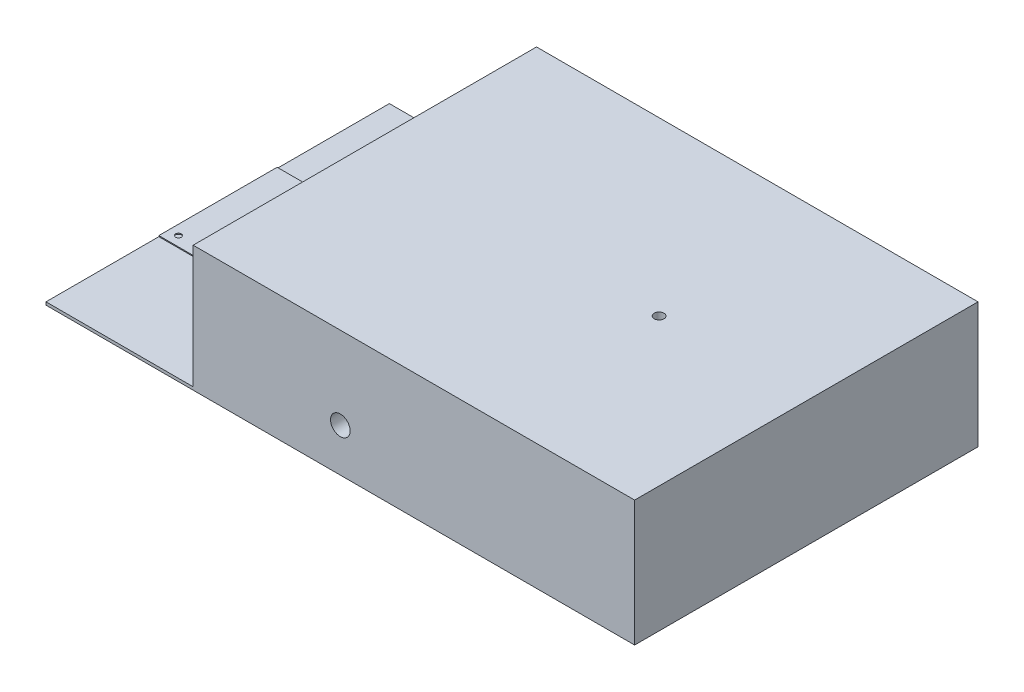
ISO-10303-21;
HEADER;
FILE_DESCRIPTION(('STEP AP214'),'2;1');
FILE_NAME('part.step','',(''),(''),'','','');
FILE_SCHEMA(('AUTOMOTIVE_DESIGN { 1 0 10303 214 1 1 1 1 }'));
ENDSEC;
DATA;
#1=APPLICATION_CONTEXT('core data for automotive mechanical design processes');
#2=APPLICATION_PROTOCOL_DEFINITION('international standard','automotive_design',2000,#1);
#3=PRODUCT_CONTEXT('',#1,'mechanical');
#4=PRODUCT('Part','Part','',(#3));
#5=PRODUCT_RELATED_PRODUCT_CATEGORY('part','',(#4));
#6=PRODUCT_DEFINITION_FORMATION('','',#4);
#7=PRODUCT_DEFINITION_CONTEXT('part definition',#1,'design');
#8=PRODUCT_DEFINITION('design','',#6,#7);
#9=PRODUCT_DEFINITION_SHAPE('','',#8);
#10=(LENGTH_UNIT() NAMED_UNIT(*) SI_UNIT(.MILLI.,.METRE.));
#11=(NAMED_UNIT(*) PLANE_ANGLE_UNIT() SI_UNIT($,.RADIAN.));
#12=(NAMED_UNIT(*) SI_UNIT($,.STERADIAN.) SOLID_ANGLE_UNIT());
#13=UNCERTAINTY_MEASURE_WITH_UNIT(LENGTH_MEASURE(1.E-05),#10,'distance_accuracy_value','');
#14=(GEOMETRIC_REPRESENTATION_CONTEXT(3) GLOBAL_UNCERTAINTY_ASSIGNED_CONTEXT((#13)) GLOBAL_UNIT_ASSIGNED_CONTEXT((#10,
#11,#12)) REPRESENTATION_CONTEXT('',''));
#15=CARTESIAN_POINT('',(0.,0.,0.));
#16=DIRECTION('',(0.,0.,1.));
#17=DIRECTION('',(1.,0.,0.));
#18=AXIS2_PLACEMENT_3D('',#15,#16,#17);
#19=CARTESIAN_POINT('',(300.,3.,-175.));
#20=DIRECTION('',(-1.,0.,0.));
#21=DIRECTION('',(0.,0.,1.));
#22=AXIS2_PLACEMENT_3D('',#19,#20,#21);
#23=PLANE('',#22);
#24=DIRECTION('',(0.,0.,-1.));
#25=VECTOR('',#24,1.);
#26=CARTESIAN_POINT('',(300.,0.,-175.));
#27=LINE('',#26,#25);
#28=CARTESIAN_POINT('',(300.,0.,175.));
#29=VERTEX_POINT('',#28);
#30=CARTESIAN_POINT('',(300.,0.,-175.));
#31=VERTEX_POINT('',#30);
#32=EDGE_CURVE('E166',#29,#31,#27,.T.);
#33=ORIENTED_EDGE('',*,*,#32,.T.);
#34=DIRECTION('',(0.,-1.,0.));
#35=VECTOR('',#34,1.);
#36=CARTESIAN_POINT('',(300.,3.,-175.));
#37=LINE('',#36,#35);
#38=CARTESIAN_POINT('',(300.,128.,-175.));
#39=VERTEX_POINT('',#38);
#40=EDGE_CURVE('E192',#39,#31,#37,.T.);
#41=ORIENTED_EDGE('',*,*,#40,.F.);
#42=DIRECTION('',(0.,0.,-1.));
#43=VECTOR('',#42,1.);
#44=CARTESIAN_POINT('',(300.,128.,-175.));
#45=LINE('',#44,#43);
#46=CARTESIAN_POINT('',(300.,128.,175.));
#47=VERTEX_POINT('',#46);
#48=EDGE_CURVE('E149',#47,#39,#45,.T.);
#49=ORIENTED_EDGE('',*,*,#48,.F.);
#50=DIRECTION('',(0.,-1.,0.));
#51=VECTOR('',#50,1.);
#52=CARTESIAN_POINT('',(300.,3.,175.));
#53=LINE('',#52,#51);
#54=EDGE_CURVE('E176',#47,#29,#53,.T.);
#55=ORIENTED_EDGE('',*,*,#54,.T.);
#56=EDGE_LOOP('',(#33,#41,#49,#55));
#57=FACE_BOUND('',#56,.T.);
#58=ADVANCED_FACE('F33',(#57),#23,.F.);
#59=CARTESIAN_POINT('',(-300.,3.,-175.));
#60=DIRECTION('',(0.,0.,1.));
#61=DIRECTION('',(1.,0.,0.));
#62=AXIS2_PLACEMENT_3D('',#59,#60,#61);
#63=PLANE('',#62);
#64=CARTESIAN_POINT('',(0.,44.,-175.));
#65=DIRECTION('',(0.,0.,1.));
#66=DIRECTION('',(1.,0.,0.));
#67=AXIS2_PLACEMENT_3D('',#64,#65,#66);
#68=CIRCLE('',#67,10.);
#69=CARTESIAN_POINT('',(10.,44.,-175.));
#70=VERTEX_POINT('',#69);
#71=EDGE_CURVE('E144',#70,#70,#68,.T.);
#72=ORIENTED_EDGE('',*,*,#71,.T.);
#73=EDGE_LOOP('',(#72));
#74=FACE_BOUND('',#73,.T.);
#75=DIRECTION('',(-1.,0.,0.));
#76=VECTOR('',#75,1.);
#77=CARTESIAN_POINT('',(-300.,0.,-175.));
#78=LINE('',#77,#76);
#79=CARTESIAN_POINT('',(-300.,0.,-175.));
#80=VERTEX_POINT('',#79);
#81=EDGE_CURVE('E179',#31,#80,#78,.T.);
#82=ORIENTED_EDGE('',*,*,#81,.T.);
#83=DIRECTION('',(0.,-1.,0.));
#84=VECTOR('',#83,1.);
#85=CARTESIAN_POINT('',(-300.,3.,-175.));
#86=LINE('',#85,#84);
#87=CARTESIAN_POINT('',(-300.,3.,-175.));
#88=VERTEX_POINT('',#87);
#89=EDGE_CURVE('E189',#88,#80,#86,.T.);
#90=ORIENTED_EDGE('',*,*,#89,.F.);
#91=DIRECTION('',(-1.,0.,0.));
#92=VECTOR('',#91,1.);
#93=CARTESIAN_POINT('',(-300.,3.,-175.));
#94=LINE('',#93,#92);
#95=CARTESIAN_POINT('',(-150.,3.,-175.));
#96=VERTEX_POINT('',#95);
#97=EDGE_CURVE('E167',#96,#88,#94,.T.);
#98=ORIENTED_EDGE('',*,*,#97,.F.);
#99=DIRECTION('',(0.,-1.,0.));
#100=VECTOR('',#99,1.);
#101=CARTESIAN_POINT('',(-150.,128.,-175.));
#102=LINE('',#101,#100);
#103=CARTESIAN_POINT('',(-150.,128.,-175.));
#104=VERTEX_POINT('',#103);
#105=EDGE_CURVE('E163',#104,#96,#102,.T.);
#106=ORIENTED_EDGE('',*,*,#105,.F.);
#107=DIRECTION('',(-1.,0.,0.));
#108=VECTOR('',#107,1.);
#109=CARTESIAN_POINT('',(300.,128.,-175.));
#110=LINE('',#109,#108);
#111=EDGE_CURVE('E152',#39,#104,#110,.T.);
#112=ORIENTED_EDGE('',*,*,#111,.F.);
#113=ORIENTED_EDGE('',*,*,#40,.T.);
#114=EDGE_LOOP('',(#82,#90,#98,#106,#112,#113));
#115=FACE_BOUND('',#114,.T.);
#116=ADVANCED_FACE('F225',(#74,#115),#63,.F.);
#117=CARTESIAN_POINT('',(-300.,3.,-175.));
#118=DIRECTION('',(1.,0.,0.));
#119=DIRECTION('',(0.,0.,-1.));
#120=AXIS2_PLACEMENT_3D('',#117,#118,#119);
#121=PLANE('',#120);
#122=DIRECTION('',(0.,-1.,0.));
#123=VECTOR('',#122,1.);
#124=CARTESIAN_POINT('',(-300.,4.,-60.5777939495785));
#125=LINE('',#124,#123);
#126=CARTESIAN_POINT('',(-300.,4.,-60.5777939495785));
#127=VERTEX_POINT('',#126);
#128=CARTESIAN_POINT('',(-300.,3.,-60.5777939495785));
#129=VERTEX_POINT('',#128);
#130=EDGE_CURVE('E116',#127,#129,#125,.T.);
#131=ORIENTED_EDGE('',*,*,#130,.T.);
#132=DIRECTION('',(0.,0.,1.));
#133=VECTOR('',#132,1.);
#134=CARTESIAN_POINT('',(-300.,3.,-175.));
#135=LINE('',#134,#133);
#136=EDGE_CURVE('E171',#88,#129,#135,.T.);
#137=ORIENTED_EDGE('',*,*,#136,.F.);
#138=ORIENTED_EDGE('',*,*,#89,.T.);
#139=DIRECTION('',(0.,0.,1.));
#140=VECTOR('',#139,1.);
#141=CARTESIAN_POINT('',(-300.,0.,-175.));
#142=LINE('',#141,#140);
#143=CARTESIAN_POINT('',(-300.,0.,175.));
#144=VERTEX_POINT('',#143);
#145=EDGE_CURVE('E181',#80,#144,#142,.T.);
#146=ORIENTED_EDGE('',*,*,#145,.T.);
#147=DIRECTION('',(0.,-1.,0.));
#148=VECTOR('',#147,1.);
#149=CARTESIAN_POINT('',(-300.,3.,175.));
#150=LINE('',#149,#148);
#151=CARTESIAN_POINT('',(-300.,3.,175.));
#152=VERTEX_POINT('',#151);
#153=EDGE_CURVE('E186',#152,#144,#150,.T.);
#154=ORIENTED_EDGE('',*,*,#153,.F.);
#155=CARTESIAN_POINT('',(-300.,3.,60.));
#156=VERTEX_POINT('',#155);
#157=EDGE_CURVE('E169',#156,#152,#135,.T.);
#158=ORIENTED_EDGE('',*,*,#157,.F.);
#159=DIRECTION('',(0.,-1.,0.));
#160=VECTOR('',#159,1.);
#161=CARTESIAN_POINT('',(-300.,4.,60.));
#162=LINE('',#161,#160);
#163=CARTESIAN_POINT('',(-300.,4.,60.));
#164=VERTEX_POINT('',#163);
#165=EDGE_CURVE('E47',#164,#156,#162,.T.);
#166=ORIENTED_EDGE('',*,*,#165,.F.);
#167=DIRECTION('',(0.,0.,1.));
#168=VECTOR('',#167,1.);
#169=CARTESIAN_POINT('',(-300.,4.,-60.5777939495785));
#170=LINE('',#169,#168);
#171=EDGE_CURVE('E119',#127,#164,#170,.T.);
#172=ORIENTED_EDGE('',*,*,#171,.F.);
#173=EDGE_LOOP('',(#131,#137,#138,#146,#154,#158,#166,#172));
#174=FACE_BOUND('',#173,.T.);
#175=ADVANCED_FACE('F206',(#174),#121,.F.);
#176=CARTESIAN_POINT('',(-300.,3.,175.));
#177=DIRECTION('',(0.,0.,-1.));
#178=DIRECTION('',(-1.,0.,0.));
#179=AXIS2_PLACEMENT_3D('',#176,#177,#178);
#180=PLANE('',#179);
#181=CARTESIAN_POINT('',(0.,44.,175.));
#182=DIRECTION('',(0.,0.,1.));
#183=DIRECTION('',(1.,0.,0.));
#184=AXIS2_PLACEMENT_3D('',#181,#182,#183);
#185=CIRCLE('',#184,10.);
#186=CARTESIAN_POINT('',(10.,44.,175.));
#187=VERTEX_POINT('',#186);
#188=EDGE_CURVE('E142',#187,#187,#185,.T.);
#189=ORIENTED_EDGE('',*,*,#188,.F.);
#190=EDGE_LOOP('',(#189));
#191=FACE_BOUND('',#190,.T.);
#192=DIRECTION('',(1.,0.,0.));
#193=VECTOR('',#192,1.);
#194=CARTESIAN_POINT('',(-300.,0.,175.));
#195=LINE('',#194,#193);
#196=EDGE_CURVE('E170',#144,#29,#195,.T.);
#197=ORIENTED_EDGE('',*,*,#196,.T.);
#198=ORIENTED_EDGE('',*,*,#54,.F.);
#199=DIRECTION('',(1.,0.,0.));
#200=VECTOR('',#199,1.);
#201=CARTESIAN_POINT('',(300.,128.,175.));
#202=LINE('',#201,#200);
#203=CARTESIAN_POINT('',(-150.,128.,175.));
#204=VERTEX_POINT('',#203);
#205=EDGE_CURVE('E156',#204,#47,#202,.T.);
#206=ORIENTED_EDGE('',*,*,#205,.F.);
#207=DIRECTION('',(0.,-1.,0.));
#208=VECTOR('',#207,1.);
#209=CARTESIAN_POINT('',(-150.,128.,175.));
#210=LINE('',#209,#208);
#211=CARTESIAN_POINT('',(-150.,3.,175.));
#212=VERTEX_POINT('',#211);
#213=EDGE_CURVE('E159',#204,#212,#210,.T.);
#214=ORIENTED_EDGE('',*,*,#213,.T.);
#215=DIRECTION('',(1.,0.,0.));
#216=VECTOR('',#215,1.);
#217=CARTESIAN_POINT('',(-300.,3.,175.));
#218=LINE('',#217,#216);
#219=EDGE_CURVE('E174',#152,#212,#218,.T.);
#220=ORIENTED_EDGE('',*,*,#219,.F.);
#221=ORIENTED_EDGE('',*,*,#153,.T.);
#222=EDGE_LOOP('',(#197,#198,#206,#214,#220,#221));
#223=FACE_BOUND('',#222,.T.);
#224=ADVANCED_FACE('F247',(#191,#223),#180,.F.);
#225=CARTESIAN_POINT('',(0.,3.,0.));
#226=DIRECTION('',(0.,1.,0.));
#227=DIRECTION('',(0.,0.,1.));
#228=AXIS2_PLACEMENT_3D('',#225,#226,#227);
#229=PLANE('',#228);
#230=ORIENTED_EDGE('',*,*,#136,.T.);
#231=DIRECTION('',(1.,0.,0.));
#232=VECTOR('',#231,1.);
#233=CARTESIAN_POINT('',(0.,3.,-60.5777939495785));
#234=LINE('',#233,#232);
#235=CARTESIAN_POINT('',(-180.,3.,-60.5777939495785));
#236=VERTEX_POINT('',#235);
#237=EDGE_CURVE('E11',#129,#236,#234,.T.);
#238=ORIENTED_EDGE('',*,*,#237,.T.);
#239=DIRECTION('',(0.,0.,1.));
#240=VECTOR('',#239,1.);
#241=CARTESIAN_POINT('',(-180.,3.,0.));
#242=LINE('',#241,#240);
#243=CARTESIAN_POINT('',(-180.,3.,60.));
#244=VERTEX_POINT('',#243);
#245=EDGE_CURVE('E40',#236,#244,#242,.T.);
#246=ORIENTED_EDGE('',*,*,#245,.T.);
#247=DIRECTION('',(-1.,0.,0.));
#248=VECTOR('',#247,1.);
#249=CARTESIAN_POINT('',(0.,3.,60.));
#250=LINE('',#249,#248);
#251=EDGE_CURVE('E201',#244,#156,#250,.T.);
#252=ORIENTED_EDGE('',*,*,#251,.T.);
#253=ORIENTED_EDGE('',*,*,#157,.T.);
#254=ORIENTED_EDGE('',*,*,#219,.T.);
#255=DIRECTION('',(0.,0.,1.));
#256=VECTOR('',#255,1.);
#257=CARTESIAN_POINT('',(-150.,3.,-175.));
#258=LINE('',#257,#256);
#259=EDGE_CURVE('E55',#96,#212,#258,.T.);
#260=ORIENTED_EDGE('',*,*,#259,.F.);
#261=ORIENTED_EDGE('',*,*,#97,.T.);
#262=EDGE_LOOP('',(#230,#238,#246,#252,#253,#254,#260,#261));
#263=FACE_BOUND('',#262,.T.);
#264=ADVANCED_FACE('F202',(#263),#229,.T.);
#265=CARTESIAN_POINT('',(0.,0.,0.));
#266=DIRECTION('',(0.,1.,0.));
#267=DIRECTION('',(0.,0.,1.));
#268=AXIS2_PLACEMENT_3D('',#265,#266,#267);
#269=PLANE('',#268);
#270=ORIENTED_EDGE('',*,*,#32,.F.);
#271=ORIENTED_EDGE('',*,*,#196,.F.);
#272=ORIENTED_EDGE('',*,*,#145,.F.);
#273=ORIENTED_EDGE('',*,*,#81,.F.);
#274=EDGE_LOOP('',(#270,#271,#272,#273));
#275=FACE_BOUND('',#274,.T.);
#276=ADVANCED_FACE('F236',(#275),#269,.F.);
#277=CARTESIAN_POINT('',(-150.,128.,-175.));
#278=DIRECTION('',(1.,0.,0.));
#279=DIRECTION('',(0.,0.,-1.));
#280=AXIS2_PLACEMENT_3D('',#277,#278,#279);
#281=PLANE('',#280);
#282=ORIENTED_EDGE('',*,*,#259,.T.);
#283=ORIENTED_EDGE('',*,*,#213,.F.);
#284=DIRECTION('',(0.,0.,1.));
#285=VECTOR('',#284,1.);
#286=CARTESIAN_POINT('',(-150.,128.,-175.));
#287=LINE('',#286,#285);
#288=EDGE_CURVE('E154',#104,#204,#287,.T.);
#289=ORIENTED_EDGE('',*,*,#288,.F.);
#290=ORIENTED_EDGE('',*,*,#105,.T.);
#291=EDGE_LOOP('',(#282,#283,#289,#290));
#292=FACE_BOUND('',#291,.T.);
#293=ADVANCED_FACE('F251',(#292),#281,.F.);
#294=CARTESIAN_POINT('',(0.,128.,0.));
#295=DIRECTION('',(0.,-1.,0.));
#296=DIRECTION('',(0.,0.,-1.));
#297=AXIS2_PLACEMENT_3D('',#294,#295,#296);
#298=PLANE('',#297);
#299=CARTESIAN_POINT('',(150.,128.,0.));
#300=DIRECTION('',(0.,1.,0.));
#301=DIRECTION('',(0.,0.,1.));
#302=AXIS2_PLACEMENT_3D('',#299,#300,#301);
#303=CIRCLE('',#302,4.99999999999999);
#304=CARTESIAN_POINT('',(150.,128.,4.99999999999999));
#305=VERTEX_POINT('',#304);
#306=EDGE_CURVE('E133',#305,#305,#303,.T.);
#307=ORIENTED_EDGE('',*,*,#306,.F.);
#308=EDGE_LOOP('',(#307));
#309=FACE_BOUND('',#308,.T.);
#310=ORIENTED_EDGE('',*,*,#48,.T.);
#311=ORIENTED_EDGE('',*,*,#111,.T.);
#312=ORIENTED_EDGE('',*,*,#288,.T.);
#313=ORIENTED_EDGE('',*,*,#205,.T.);
#314=EDGE_LOOP('',(#310,#311,#312,#313));
#315=FACE_BOUND('',#314,.T.);
#316=ADVANCED_FACE('F243',(#309,#315),#298,.F.);
#317=CARTESIAN_POINT('',(0.,44.,-175.));
#318=DIRECTION('',(0.,0.,1.));
#319=DIRECTION('',(1.,0.,0.));
#320=AXIS2_PLACEMENT_3D('',#317,#318,#319);
#321=CYLINDRICAL_SURFACE('',#320,10.);
#322=ORIENTED_EDGE('',*,*,#71,.F.);
#323=EDGE_LOOP('',(#322));
#324=FACE_BOUND('',#323,.T.);
#325=ORIENTED_EDGE('',*,*,#188,.T.);
#326=EDGE_LOOP('',(#325));
#327=FACE_BOUND('',#326,.T.);
#328=ADVANCED_FACE('F258',(#324,#327),#321,.F.);
#329=CARTESIAN_POINT('',(150.,108.,0.));
#330=DIRECTION('',(0.,1.,0.));
#331=DIRECTION('',(0.,0.,1.));
#332=AXIS2_PLACEMENT_3D('',#329,#330,#331);
#333=CYLINDRICAL_SURFACE('',#332,4.99999999999999);
#334=CARTESIAN_POINT('',(150.,108.,0.));
#335=DIRECTION('',(0.,1.,0.));
#336=DIRECTION('',(0.,0.,1.));
#337=AXIS2_PLACEMENT_3D('',#334,#335,#336);
#338=CIRCLE('',#337,4.99999999999999);
#339=CARTESIAN_POINT('',(150.,108.,4.99999999999999));
#340=VERTEX_POINT('',#339);
#341=EDGE_CURVE('E136',#340,#340,#338,.T.);
#342=ORIENTED_EDGE('',*,*,#341,.F.);
#343=EDGE_LOOP('',(#342));
#344=FACE_BOUND('',#343,.T.);
#345=ORIENTED_EDGE('',*,*,#306,.T.);
#346=EDGE_LOOP('',(#345));
#347=FACE_BOUND('',#346,.T.);
#348=ADVANCED_FACE('F392',(#344,#347),#333,.F.);
#349=CARTESIAN_POINT('',(150.,108.,0.));
#350=DIRECTION('',(0.,1.,0.));
#351=DIRECTION('',(0.,0.,1.));
#352=AXIS2_PLACEMENT_3D('',#349,#350,#351);
#353=PLANE('',#352);
#354=ORIENTED_EDGE('',*,*,#341,.T.);
#355=EDGE_LOOP('',(#354));
#356=FACE_BOUND('',#355,.T.);
#357=ADVANCED_FACE('F334',(#356),#353,.T.);
#358=CARTESIAN_POINT('',(0.,4.,0.));
#359=DIRECTION('',(0.,1.,0.));
#360=DIRECTION('',(0.,0.,1.));
#361=AXIS2_PLACEMENT_3D('',#358,#359,#360);
#362=PLANE('',#361);
#363=CARTESIAN_POINT('',(-190.,4.,-50.5777939495785));
#364=DIRECTION('',(0.,1.,0.));
#365=DIRECTION('',(0.,0.,1.));
#366=AXIS2_PLACEMENT_3D('',#363,#364,#365);
#367=CIRCLE('',#366,2.99999999999999);
#368=CARTESIAN_POINT('',(-190.,4.,-47.5777939495785));
#369=VERTEX_POINT('',#368);
#370=EDGE_CURVE('E129',#369,#369,#367,.T.);
#371=ORIENTED_EDGE('',*,*,#370,.F.);
#372=EDGE_LOOP('',(#371));
#373=FACE_BOUND('',#372,.T.);
#374=DIRECTION('',(0.,0.,-1.));
#375=VECTOR('',#374,1.);
#376=CARTESIAN_POINT('',(-180.,4.,-60.5777939495785));
#377=LINE('',#376,#375);
#378=CARTESIAN_POINT('',(-180.,4.,60.));
#379=VERTEX_POINT('',#378);
#380=CARTESIAN_POINT('',(-180.,4.,-60.5777939495785));
#381=VERTEX_POINT('',#380);
#382=EDGE_CURVE('E120',#379,#381,#377,.T.);
#383=ORIENTED_EDGE('',*,*,#382,.T.);
#384=DIRECTION('',(-1.,0.,0.));
#385=VECTOR('',#384,1.);
#386=CARTESIAN_POINT('',(-300.,4.,-60.5777939495785));
#387=LINE('',#386,#385);
#388=EDGE_CURVE('E110',#381,#127,#387,.T.);
#389=ORIENTED_EDGE('',*,*,#388,.T.);
#390=ORIENTED_EDGE('',*,*,#171,.T.);
#391=DIRECTION('',(1.,0.,0.));
#392=VECTOR('',#391,1.);
#393=CARTESIAN_POINT('',(-300.,4.,60.));
#394=LINE('',#393,#392);
#395=EDGE_CURVE('E125',#164,#379,#394,.T.);
#396=ORIENTED_EDGE('',*,*,#395,.T.);
#397=EDGE_LOOP('',(#383,#389,#390,#396));
#398=FACE_BOUND('',#397,.T.);
#399=CARTESIAN_POINT('',(-290.,4.,50.));
#400=DIRECTION('',(0.,1.,0.));
#401=DIRECTION('',(0.,0.,1.));
#402=AXIS2_PLACEMENT_3D('',#399,#400,#401);
#403=CIRCLE('',#402,2.99999999999999);
#404=CARTESIAN_POINT('',(-290.,4.,53.));
#405=VERTEX_POINT('',#404);
#406=EDGE_CURVE('E382',#405,#405,#403,.T.);
#407=ORIENTED_EDGE('',*,*,#406,.F.);
#408=EDGE_LOOP('',(#407));
#409=FACE_BOUND('',#408,.T.);
#410=ADVANCED_FACE('F123',(#373,#398,#409),#362,.T.);
#411=CARTESIAN_POINT('',(-180.,4.,-60.5777939495785));
#412=DIRECTION('',(-1.,0.,0.));
#413=DIRECTION('',(0.,0.,1.));
#414=AXIS2_PLACEMENT_3D('',#411,#412,#413);
#415=PLANE('',#414);
#416=ORIENTED_EDGE('',*,*,#245,.F.);
#417=DIRECTION('',(0.,-1.,0.));
#418=VECTOR('',#417,1.);
#419=CARTESIAN_POINT('',(-180.,4.,-60.5777939495785));
#420=LINE('',#419,#418);
#421=EDGE_CURVE('E114',#381,#236,#420,.T.);
#422=ORIENTED_EDGE('',*,*,#421,.F.);
#423=ORIENTED_EDGE('',*,*,#382,.F.);
#424=DIRECTION('',(0.,-1.,0.));
#425=VECTOR('',#424,1.);
#426=CARTESIAN_POINT('',(-180.,4.,60.));
#427=LINE('',#426,#425);
#428=EDGE_CURVE('E208',#379,#244,#427,.T.);
#429=ORIENTED_EDGE('',*,*,#428,.T.);
#430=EDGE_LOOP('',(#416,#422,#423,#429));
#431=FACE_BOUND('',#430,.T.);
#432=ADVANCED_FACE('F131',(#431),#415,.F.);
#433=CARTESIAN_POINT('',(-300.,4.,-60.5777939495785));
#434=DIRECTION('',(0.,0.,1.));
#435=DIRECTION('',(1.,0.,0.));
#436=AXIS2_PLACEMENT_3D('',#433,#434,#435);
#437=PLANE('',#436);
#438=ORIENTED_EDGE('',*,*,#237,.F.);
#439=ORIENTED_EDGE('',*,*,#130,.F.);
#440=ORIENTED_EDGE('',*,*,#388,.F.);
#441=ORIENTED_EDGE('',*,*,#421,.T.);
#442=EDGE_LOOP('',(#438,#439,#440,#441));
#443=FACE_BOUND('',#442,.T.);
#444=ADVANCED_FACE('F112',(#443),#437,.F.);
#445=CARTESIAN_POINT('',(-300.,4.,60.));
#446=DIRECTION('',(0.,0.,-1.));
#447=DIRECTION('',(-1.,0.,0.));
#448=AXIS2_PLACEMENT_3D('',#445,#446,#447);
#449=PLANE('',#448);
#450=ORIENTED_EDGE('',*,*,#251,.F.);
#451=ORIENTED_EDGE('',*,*,#428,.F.);
#452=ORIENTED_EDGE('',*,*,#395,.F.);
#453=ORIENTED_EDGE('',*,*,#165,.T.);
#454=EDGE_LOOP('',(#450,#451,#452,#453));
#455=FACE_BOUND('',#454,.T.);
#456=ADVANCED_FACE('F211',(#455),#449,.F.);
#457=CARTESIAN_POINT('',(-190.,4.,-50.5777939495785));
#458=DIRECTION('',(0.,-1.,0.));
#459=DIRECTION('',(0.,0.,-1.));
#460=AXIS2_PLACEMENT_3D('',#457,#458,#459);
#461=CYLINDRICAL_SURFACE('',#460,2.99999999999999);
#462=CARTESIAN_POINT('',(-190.,3.,-50.5777939495785));
#463=DIRECTION('',(0.,1.,0.));
#464=DIRECTION('',(0.,0.,1.));
#465=AXIS2_PLACEMENT_3D('',#462,#463,#464);
#466=CIRCLE('',#465,2.99999999999999);
#467=CARTESIAN_POINT('',(-190.,3.,-47.5777939495785));
#468=VERTEX_POINT('',#467);
#469=EDGE_CURVE('E198',#468,#468,#466,.F.);
#470=ORIENTED_EDGE('',*,*,#469,.T.);
#471=EDGE_LOOP('',(#470));
#472=FACE_BOUND('',#471,.T.);
#473=ORIENTED_EDGE('',*,*,#370,.T.);
#474=EDGE_LOOP('',(#473));
#475=FACE_BOUND('',#474,.T.);
#476=ADVANCED_FACE('F213',(#472,#475),#461,.F.);
#477=CARTESIAN_POINT('',(-290.,4.,50.));
#478=DIRECTION('',(0.,-1.,0.));
#479=DIRECTION('',(0.,0.,-1.));
#480=AXIS2_PLACEMENT_3D('',#477,#478,#479);
#481=CYLINDRICAL_SURFACE('',#480,2.99999999999999);
#482=CARTESIAN_POINT('',(-290.,3.,50.));
#483=DIRECTION('',(0.,1.,0.));
#484=DIRECTION('',(0.,0.,1.));
#485=AXIS2_PLACEMENT_3D('',#482,#483,#484);
#486=CIRCLE('',#485,2.99999999999999);
#487=CARTESIAN_POINT('',(-290.,3.,53.));
#488=VERTEX_POINT('',#487);
#489=EDGE_CURVE('E195',#488,#488,#486,.F.);
#490=ORIENTED_EDGE('',*,*,#489,.T.);
#491=EDGE_LOOP('',(#490));
#492=FACE_BOUND('',#491,.T.);
#493=ORIENTED_EDGE('',*,*,#406,.T.);
#494=EDGE_LOOP('',(#493));
#495=FACE_BOUND('',#494,.T.);
#496=ADVANCED_FACE('F219',(#492,#495),#481,.F.);
#497=ORIENTED_EDGE('',*,*,#489,.F.);
#498=EDGE_LOOP('',(#497));
#499=FACE_BOUND('',#498,.T.);
#500=ADVANCED_FACE('F266',(#499),#229,.T.);
#501=ORIENTED_EDGE('',*,*,#469,.F.);
#502=EDGE_LOOP('',(#501));
#503=FACE_BOUND('',#502,.T.);
#504=ADVANCED_FACE('F265',(#503),#229,.T.);
#505=CLOSED_SHELL('',(#58,#116,#175,#224,#264,#276,#293,#316,#328,#348,#357,#410,#432,#444,#456,
#476,#496,#500,#504));
#506=MANIFOLD_SOLID_BREP('B2',#505);
#507=ADVANCED_BREP_SHAPE_REPRESENTATION('',(#18,#506),#14);
#508=SHAPE_DEFINITION_REPRESENTATION(#9,#507);
ENDSEC;
END-ISO-10303-21;
